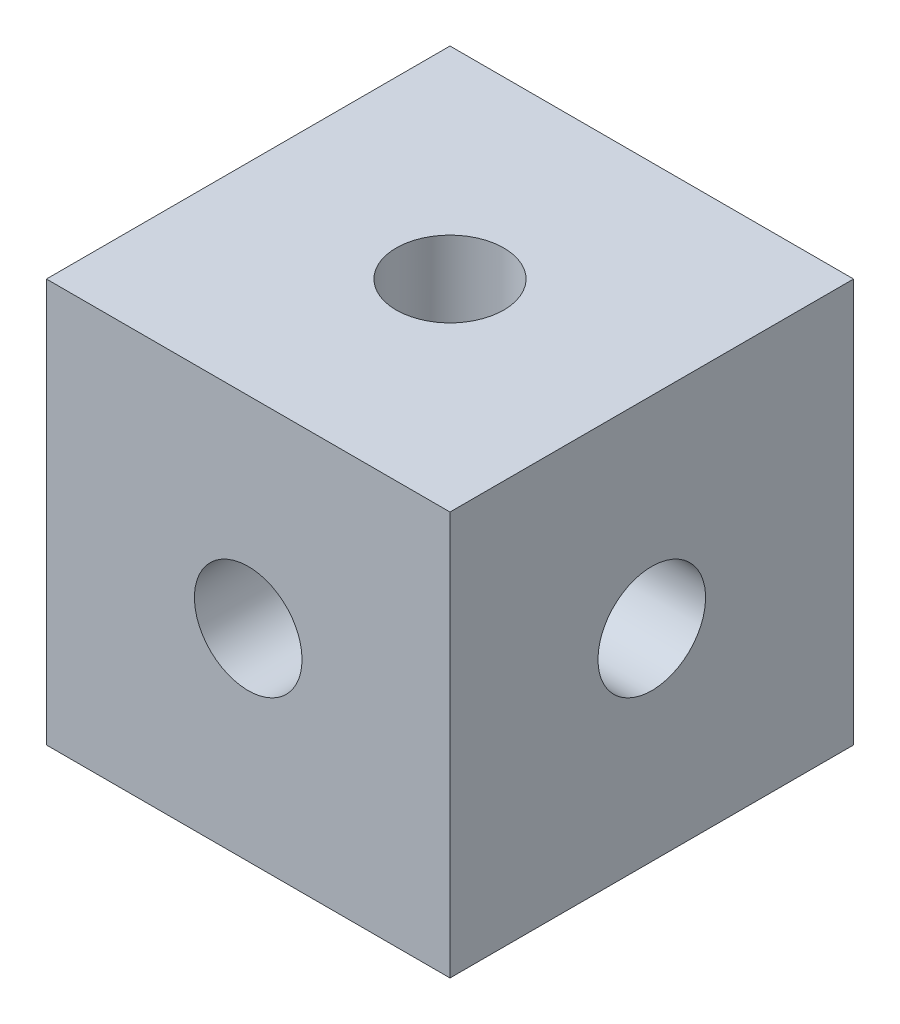
ISO-10303-21;
HEADER;
FILE_DESCRIPTION(('STEP AP214'),'2;1');
FILE_NAME('part.step','',(''),(''),'','','');
FILE_SCHEMA(('AUTOMOTIVE_DESIGN { 1 0 10303 214 1 1 1 1 }'));
ENDSEC;
DATA;
#1=APPLICATION_CONTEXT('core data for automotive mechanical design processes');
#2=APPLICATION_PROTOCOL_DEFINITION('international standard','automotive_design',2000,#1);
#3=PRODUCT_CONTEXT('',#1,'mechanical');
#4=PRODUCT('Part','Part','',(#3));
#5=PRODUCT_RELATED_PRODUCT_CATEGORY('part','',(#4));
#6=PRODUCT_DEFINITION_FORMATION('','',#4);
#7=PRODUCT_DEFINITION_CONTEXT('part definition',#1,'design');
#8=PRODUCT_DEFINITION('design','',#6,#7);
#9=PRODUCT_DEFINITION_SHAPE('','',#8);
#10=(LENGTH_UNIT() NAMED_UNIT(*) SI_UNIT(.MILLI.,.METRE.));
#11=(NAMED_UNIT(*) PLANE_ANGLE_UNIT() SI_UNIT($,.RADIAN.));
#12=(NAMED_UNIT(*) SI_UNIT($,.STERADIAN.) SOLID_ANGLE_UNIT());
#13=UNCERTAINTY_MEASURE_WITH_UNIT(LENGTH_MEASURE(1.E-05),#10,'distance_accuracy_value','');
#14=(GEOMETRIC_REPRESENTATION_CONTEXT(3) GLOBAL_UNCERTAINTY_ASSIGNED_CONTEXT((#13)) GLOBAL_UNIT_ASSIGNED_CONTEXT((#10,
#11,#12)) REPRESENTATION_CONTEXT('',''));
#15=CARTESIAN_POINT('',(0.,0.,0.));
#16=DIRECTION('',(0.,0.,1.));
#17=DIRECTION('',(1.,0.,0.));
#18=AXIS2_PLACEMENT_3D('',#15,#16,#17);
#19=CARTESIAN_POINT('',(0.,15.,0.));
#20=DIRECTION('',(0.,-1.,0.));
#21=DIRECTION('',(0.,0.,-1.));
#22=AXIS2_PLACEMENT_3D('',#19,#20,#21);
#23=CYLINDRICAL_SURFACE('',#22,2.);
#24=CARTESIAN_POINT('',(0.,7.5,0.));
#25=DIRECTION('',(-0.707106781186547,-0.707106781186547,0.));
#26=DIRECTION('',(0.707106781186547,-0.707106781186547,0.));
#27=AXIS2_PLACEMENT_3D('',#24,#25,#26);
#28=ELLIPSE('',#27,2.82842712474619,2.);
#29=CARTESIAN_POINT('',(-1.41421356237309,8.9142135623731,-1.41421356237309));
#30=VERTEX_POINT('',#29);
#31=CARTESIAN_POINT('',(-1.41421356237309,8.9142135623731,1.4142135623731));
#32=VERTEX_POINT('',#31);
#33=EDGE_CURVE('E68',#30,#32,#28,.F.);
#34=ORIENTED_EDGE('',*,*,#33,.F.);
#35=CARTESIAN_POINT('',(0.,7.5,0.));
#36=DIRECTION('',(0.,-0.707106781186547,-0.707106781186547));
#37=DIRECTION('',(0.,-0.707106781186547,0.707106781186547));
#38=AXIS2_PLACEMENT_3D('',#35,#36,#37);
#39=ELLIPSE('',#38,2.82842712474619,2.);
#40=CARTESIAN_POINT('',(1.4142135623731,8.9142135623731,-1.41421356237309));
#41=VERTEX_POINT('',#40);
#42=EDGE_CURVE('E131',#41,#30,#39,.F.);
#43=ORIENTED_EDGE('',*,*,#42,.F.);
#44=CARTESIAN_POINT('',(0.,7.5,0.));
#45=DIRECTION('',(0.707106781186547,-0.707106781186547,0.));
#46=DIRECTION('',(-0.707106781186547,-0.707106781186547,0.));
#47=AXIS2_PLACEMENT_3D('',#44,#45,#46);
#48=ELLIPSE('',#47,2.82842712474619,2.);
#49=CARTESIAN_POINT('',(1.4142135623731,8.9142135623731,1.4142135623731));
#50=VERTEX_POINT('',#49);
#51=EDGE_CURVE('E146',#50,#41,#48,.F.);
#52=ORIENTED_EDGE('',*,*,#51,.F.);
#53=CARTESIAN_POINT('',(0.,7.5,0.));
#54=DIRECTION('',(0.,-0.707106781186547,0.707106781186547));
#55=DIRECTION('',(0.,-0.707106781186547,-0.707106781186547));
#56=AXIS2_PLACEMENT_3D('',#53,#54,#55);
#57=ELLIPSE('',#56,2.82842712474619,2.);
#58=EDGE_CURVE('E116',#32,#50,#57,.F.);
#59=ORIENTED_EDGE('',*,*,#58,.F.);
#60=EDGE_LOOP('',(#34,#43,#52,#59));
#61=FACE_BOUND('',#60,.T.);
#62=CARTESIAN_POINT('',(0.,15.,0.));
#63=DIRECTION('',(0.,1.,0.));
#64=DIRECTION('',(0.,0.,1.));
#65=AXIS2_PLACEMENT_3D('',#62,#63,#64);
#66=CIRCLE('',#65,2.);
#67=CARTESIAN_POINT('',(0.,15.,2.));
#68=VERTEX_POINT('',#67);
#69=EDGE_CURVE('E167',#68,#68,#66,.T.);
#70=ORIENTED_EDGE('',*,*,#69,.T.);
#71=EDGE_LOOP('',(#70));
#72=FACE_BOUND('',#71,.T.);
#73=ADVANCED_FACE('F45',(#61,#72),#23,.F.);
#74=CARTESIAN_POINT('',(0.,15.,0.));
#75=DIRECTION('',(0.,1.,0.));
#76=DIRECTION('',(0.,0.,1.));
#77=AXIS2_PLACEMENT_3D('',#74,#75,#76);
#78=PLANE('',#77);
#79=DIRECTION('',(0.,0.,-1.));
#80=VECTOR('',#79,1.);
#81=CARTESIAN_POINT('',(7.5,15.,-7.5));
#82=LINE('',#81,#80);
#83=CARTESIAN_POINT('',(7.5,15.,7.5));
#84=VERTEX_POINT('',#83);
#85=CARTESIAN_POINT('',(7.5,15.,-7.5));
#86=VERTEX_POINT('',#85);
#87=EDGE_CURVE('E175',#84,#86,#82,.T.);
#88=ORIENTED_EDGE('',*,*,#87,.T.);
#89=DIRECTION('',(-1.,0.,0.));
#90=VECTOR('',#89,1.);
#91=CARTESIAN_POINT('',(-7.5,15.,-7.5));
#92=LINE('',#91,#90);
#93=CARTESIAN_POINT('',(-7.5,15.,-7.5));
#94=VERTEX_POINT('',#93);
#95=EDGE_CURVE('E179',#86,#94,#92,.T.);
#96=ORIENTED_EDGE('',*,*,#95,.T.);
#97=DIRECTION('',(0.,0.,1.));
#98=VECTOR('',#97,1.);
#99=CARTESIAN_POINT('',(-7.5,15.,-7.5));
#100=LINE('',#99,#98);
#101=CARTESIAN_POINT('',(-7.5,15.,7.5));
#102=VERTEX_POINT('',#101);
#103=EDGE_CURVE('E183',#94,#102,#100,.T.);
#104=ORIENTED_EDGE('',*,*,#103,.T.);
#105=DIRECTION('',(1.,0.,0.));
#106=VECTOR('',#105,1.);
#107=CARTESIAN_POINT('',(-7.5,15.,7.5));
#108=LINE('',#107,#106);
#109=EDGE_CURVE('E186',#102,#84,#108,.T.);
#110=ORIENTED_EDGE('',*,*,#109,.T.);
#111=EDGE_LOOP('',(#88,#96,#104,#110));
#112=FACE_BOUND('',#111,.T.);
#113=ORIENTED_EDGE('',*,*,#69,.F.);
#114=EDGE_LOOP('',(#113));
#115=FACE_BOUND('',#114,.T.);
#116=ADVANCED_FACE('F234',(#112,#115),#78,.T.);
#117=CARTESIAN_POINT('',(0.,0.,0.));
#118=DIRECTION('',(0.,1.,0.));
#119=DIRECTION('',(0.,0.,1.));
#120=AXIS2_PLACEMENT_3D('',#117,#118,#119);
#121=PLANE('',#120);
#122=DIRECTION('',(0.,0.,-1.));
#123=VECTOR('',#122,1.);
#124=CARTESIAN_POINT('',(7.5,0.,-7.5));
#125=LINE('',#124,#123);
#126=CARTESIAN_POINT('',(7.5,0.,7.5));
#127=VERTEX_POINT('',#126);
#128=CARTESIAN_POINT('',(7.5,0.,-7.5));
#129=VERTEX_POINT('',#128);
#130=EDGE_CURVE('E171',#127,#129,#125,.T.);
#131=ORIENTED_EDGE('',*,*,#130,.F.);
#132=DIRECTION('',(1.,0.,0.));
#133=VECTOR('',#132,1.);
#134=CARTESIAN_POINT('',(-7.5,0.,7.5));
#135=LINE('',#134,#133);
#136=CARTESIAN_POINT('',(-7.5,0.,7.5));
#137=VERTEX_POINT('',#136);
#138=EDGE_CURVE('E180',#137,#127,#135,.T.);
#139=ORIENTED_EDGE('',*,*,#138,.F.);
#140=DIRECTION('',(0.,0.,1.));
#141=VECTOR('',#140,1.);
#142=CARTESIAN_POINT('',(-7.5,0.,-7.5));
#143=LINE('',#142,#141);
#144=CARTESIAN_POINT('',(-7.5,0.,-7.5));
#145=VERTEX_POINT('',#144);
#146=EDGE_CURVE('E196',#145,#137,#143,.T.);
#147=ORIENTED_EDGE('',*,*,#146,.F.);
#148=DIRECTION('',(-1.,0.,0.));
#149=VECTOR('',#148,1.);
#150=CARTESIAN_POINT('',(-7.5,0.,-7.5));
#151=LINE('',#150,#149);
#152=EDGE_CURVE('E193',#129,#145,#151,.T.);
#153=ORIENTED_EDGE('',*,*,#152,.F.);
#154=EDGE_LOOP('',(#131,#139,#147,#153));
#155=FACE_BOUND('',#154,.T.);
#156=CARTESIAN_POINT('',(0.,0.,0.));
#157=DIRECTION('',(0.,1.,0.));
#158=DIRECTION('',(0.,0.,1.));
#159=AXIS2_PLACEMENT_3D('',#156,#157,#158);
#160=CIRCLE('',#159,2.);
#161=CARTESIAN_POINT('',(0.,0.,2.));
#162=VERTEX_POINT('',#161);
#163=EDGE_CURVE('E163',#162,#162,#160,.T.);
#164=ORIENTED_EDGE('',*,*,#163,.T.);
#165=EDGE_LOOP('',(#164));
#166=FACE_BOUND('',#165,.T.);
#167=ADVANCED_FACE('F223',(#155,#166),#121,.F.);
#168=CARTESIAN_POINT('',(7.5,15.,-7.5));
#169=DIRECTION('',(-1.,0.,0.));
#170=DIRECTION('',(0.,0.,1.));
#171=AXIS2_PLACEMENT_3D('',#168,#169,#170);
#172=PLANE('',#171);
#173=CARTESIAN_POINT('',(7.5,7.5,0.));
#174=DIRECTION('',(-1.,0.,0.));
#175=DIRECTION('',(0.,0.,1.));
#176=AXIS2_PLACEMENT_3D('',#173,#174,#175);
#177=CIRCLE('',#176,2.);
#178=CARTESIAN_POINT('',(7.5,7.5,2.));
#179=VERTEX_POINT('',#178);
#180=EDGE_CURVE('E126',#179,#179,#177,.T.);
#181=ORIENTED_EDGE('',*,*,#180,.T.);
#182=EDGE_LOOP('',(#181));
#183=FACE_BOUND('',#182,.T.);
#184=ORIENTED_EDGE('',*,*,#130,.T.);
#185=DIRECTION('',(0.,-1.,0.));
#186=VECTOR('',#185,1.);
#187=CARTESIAN_POINT('',(7.5,15.,-7.5));
#188=LINE('',#187,#186);
#189=EDGE_CURVE('E137',#86,#129,#188,.T.);
#190=ORIENTED_EDGE('',*,*,#189,.F.);
#191=ORIENTED_EDGE('',*,*,#87,.F.);
#192=DIRECTION('',(0.,-1.,0.));
#193=VECTOR('',#192,1.);
#194=CARTESIAN_POINT('',(7.5,15.,7.5));
#195=LINE('',#194,#193);
#196=EDGE_CURVE('E189',#84,#127,#195,.T.);
#197=ORIENTED_EDGE('',*,*,#196,.T.);
#198=EDGE_LOOP('',(#184,#190,#191,#197));
#199=FACE_BOUND('',#198,.T.);
#200=ADVANCED_FACE('F47',(#183,#199),#172,.F.);
#201=CARTESIAN_POINT('',(-7.5,15.,-7.5));
#202=DIRECTION('',(0.,0.,1.));
#203=DIRECTION('',(1.,0.,0.));
#204=AXIS2_PLACEMENT_3D('',#201,#202,#203);
#205=PLANE('',#204);
#206=CARTESIAN_POINT('',(0.,7.5,-7.5));
#207=DIRECTION('',(0.,0.,1.));
#208=DIRECTION('',(1.,0.,0.));
#209=AXIS2_PLACEMENT_3D('',#206,#207,#208);
#210=CIRCLE('',#209,2.);
#211=CARTESIAN_POINT('',(2.,7.5,-7.5));
#212=VERTEX_POINT('',#211);
#213=EDGE_CURVE('E159',#212,#212,#210,.T.);
#214=ORIENTED_EDGE('',*,*,#213,.T.);
#215=EDGE_LOOP('',(#214));
#216=FACE_BOUND('',#215,.T.);
#217=ORIENTED_EDGE('',*,*,#152,.T.);
#218=DIRECTION('',(0.,-1.,0.));
#219=VECTOR('',#218,1.);
#220=CARTESIAN_POINT('',(-7.5,15.,-7.5));
#221=LINE('',#220,#219);
#222=EDGE_CURVE('E208',#94,#145,#221,.T.);
#223=ORIENTED_EDGE('',*,*,#222,.F.);
#224=ORIENTED_EDGE('',*,*,#95,.F.);
#225=ORIENTED_EDGE('',*,*,#189,.T.);
#226=EDGE_LOOP('',(#217,#223,#224,#225));
#227=FACE_BOUND('',#226,.T.);
#228=ADVANCED_FACE('F215',(#216,#227),#205,.F.);
#229=CARTESIAN_POINT('',(-7.5,15.,-7.5));
#230=DIRECTION('',(1.,0.,0.));
#231=DIRECTION('',(0.,0.,-1.));
#232=AXIS2_PLACEMENT_3D('',#229,#230,#231);
#233=PLANE('',#232);
#234=CARTESIAN_POINT('',(-7.5,7.5,0.));
#235=DIRECTION('',(-1.,0.,0.));
#236=DIRECTION('',(0.,0.,1.));
#237=AXIS2_PLACEMENT_3D('',#234,#235,#236);
#238=CIRCLE('',#237,2.);
#239=CARTESIAN_POINT('',(-7.5,7.5,2.));
#240=VERTEX_POINT('',#239);
#241=EDGE_CURVE('E275',#240,#240,#238,.T.);
#242=ORIENTED_EDGE('',*,*,#241,.F.);
#243=EDGE_LOOP('',(#242));
#244=FACE_BOUND('',#243,.T.);
#245=ORIENTED_EDGE('',*,*,#146,.T.);
#246=DIRECTION('',(0.,-1.,0.));
#247=VECTOR('',#246,1.);
#248=CARTESIAN_POINT('',(-7.5,15.,7.5));
#249=LINE('',#248,#247);
#250=EDGE_CURVE('E204',#102,#137,#249,.T.);
#251=ORIENTED_EDGE('',*,*,#250,.F.);
#252=ORIENTED_EDGE('',*,*,#103,.F.);
#253=ORIENTED_EDGE('',*,*,#222,.T.);
#254=EDGE_LOOP('',(#245,#251,#252,#253));
#255=FACE_BOUND('',#254,.T.);
#256=ADVANCED_FACE('F228',(#244,#255),#233,.F.);
#257=CARTESIAN_POINT('',(-7.5,15.,7.5));
#258=DIRECTION('',(0.,0.,-1.));
#259=DIRECTION('',(-1.,0.,0.));
#260=AXIS2_PLACEMENT_3D('',#257,#258,#259);
#261=PLANE('',#260);
#262=CARTESIAN_POINT('',(0.,7.5,7.5));
#263=DIRECTION('',(0.,0.,1.));
#264=DIRECTION('',(1.,0.,0.));
#265=AXIS2_PLACEMENT_3D('',#262,#263,#264);
#266=CIRCLE('',#265,2.);
#267=CARTESIAN_POINT('',(2.,7.5,7.5));
#268=VERTEX_POINT('',#267);
#269=EDGE_CURVE('E153',#268,#268,#266,.T.);
#270=ORIENTED_EDGE('',*,*,#269,.F.);
#271=EDGE_LOOP('',(#270));
#272=FACE_BOUND('',#271,.T.);
#273=ORIENTED_EDGE('',*,*,#138,.T.);
#274=ORIENTED_EDGE('',*,*,#196,.F.);
#275=ORIENTED_EDGE('',*,*,#109,.F.);
#276=ORIENTED_EDGE('',*,*,#250,.T.);
#277=EDGE_LOOP('',(#273,#274,#275,#276));
#278=FACE_BOUND('',#277,.T.);
#279=ADVANCED_FACE('F232',(#272,#278),#261,.F.);
#280=CARTESIAN_POINT('',(0.,7.5,0.));
#281=DIRECTION('',(-0.707106781186547,-0.707106781186547,0.));
#282=DIRECTION('',(0.707106781186547,-0.707106781186547,0.));
#283=AXIS2_PLACEMENT_3D('',#280,#281,#282);
#284=ELLIPSE('',#283,2.82842712474619,2.);
#285=CARTESIAN_POINT('',(1.4142135623731,6.08578643762691,-1.41421356237309));
#286=VERTEX_POINT('',#285);
#287=CARTESIAN_POINT('',(1.4142135623731,6.08578643762691,1.4142135623731));
#288=VERTEX_POINT('',#287);
#289=EDGE_CURVE('E61',#286,#288,#284,.T.);
#290=ORIENTED_EDGE('',*,*,#289,.F.);
#291=CARTESIAN_POINT('',(0.,7.5,0.));
#292=DIRECTION('',(0.,-0.707106781186547,0.707106781186547));
#293=DIRECTION('',(0.,-0.707106781186547,-0.707106781186547));
#294=AXIS2_PLACEMENT_3D('',#291,#292,#293);
#295=ELLIPSE('',#294,2.82842712474619,2.);
#296=CARTESIAN_POINT('',(-1.41421356237309,6.08578643762691,-1.41421356237309));
#297=VERTEX_POINT('',#296);
#298=EDGE_CURVE('E124',#297,#286,#295,.T.);
#299=ORIENTED_EDGE('',*,*,#298,.F.);
#300=CARTESIAN_POINT('',(0.,7.5,0.));
#301=DIRECTION('',(0.707106781186547,-0.707106781186547,0.));
#302=DIRECTION('',(-0.707106781186547,-0.707106781186547,0.));
#303=AXIS2_PLACEMENT_3D('',#300,#301,#302);
#304=ELLIPSE('',#303,2.82842712474619,2.);
#305=CARTESIAN_POINT('',(-1.41421356237309,6.08578643762691,1.4142135623731));
#306=VERTEX_POINT('',#305);
#307=EDGE_CURVE('E109',#306,#297,#304,.T.);
#308=ORIENTED_EDGE('',*,*,#307,.F.);
#309=CARTESIAN_POINT('',(0.,7.5,0.));
#310=DIRECTION('',(0.,-0.707106781186547,-0.707106781186547));
#311=DIRECTION('',(0.,-0.707106781186547,0.707106781186547));
#312=AXIS2_PLACEMENT_3D('',#309,#310,#311);
#313=ELLIPSE('',#312,2.82842712474619,2.);
#314=EDGE_CURVE('E122',#288,#306,#313,.T.);
#315=ORIENTED_EDGE('',*,*,#314,.F.);
#316=EDGE_LOOP('',(#290,#299,#308,#315));
#317=FACE_BOUND('',#316,.T.);
#318=ORIENTED_EDGE('',*,*,#163,.F.);
#319=EDGE_LOOP('',(#318));
#320=FACE_BOUND('',#319,.T.);
#321=ADVANCED_FACE('F120',(#317,#320),#23,.F.);
#322=CARTESIAN_POINT('',(0.,7.5,-7.5));
#323=DIRECTION('',(0.,0.,1.));
#324=DIRECTION('',(1.,0.,0.));
#325=AXIS2_PLACEMENT_3D('',#322,#323,#324);
#326=CYLINDRICAL_SURFACE('',#325,2.);
#327=ORIENTED_EDGE('',*,*,#42,.T.);
#328=CARTESIAN_POINT('',(0.,7.5,0.));
#329=DIRECTION('',(-0.707106781186547,0.,0.707106781186548));
#330=DIRECTION('',(0.707106781186548,0.,0.707106781186547));
#331=AXIS2_PLACEMENT_3D('',#328,#329,#330);
#332=ELLIPSE('',#331,2.82842712474619,2.);
#333=EDGE_CURVE('E155',#30,#297,#332,.T.);
#334=ORIENTED_EDGE('',*,*,#333,.T.);
#335=ORIENTED_EDGE('',*,*,#298,.T.);
#336=CARTESIAN_POINT('',(0.,7.5,0.));
#337=DIRECTION('',(0.707106781186548,0.,0.707106781186547));
#338=DIRECTION('',(-0.707106781186547,0.,0.707106781186548));
#339=AXIS2_PLACEMENT_3D('',#336,#337,#338);
#340=ELLIPSE('',#339,2.82842712474619,2.);
#341=EDGE_CURVE('E149',#286,#41,#340,.T.);
#342=ORIENTED_EDGE('',*,*,#341,.T.);
#343=EDGE_LOOP('',(#327,#334,#335,#342));
#344=FACE_BOUND('',#343,.T.);
#345=ORIENTED_EDGE('',*,*,#213,.F.);
#346=EDGE_LOOP('',(#345));
#347=FACE_BOUND('',#346,.T.);
#348=ADVANCED_FACE('F247',(#344,#347),#326,.F.);
#349=ORIENTED_EDGE('',*,*,#58,.T.);
#350=CARTESIAN_POINT('',(0.,7.5,0.));
#351=DIRECTION('',(-0.707106781186547,0.,0.707106781186548));
#352=DIRECTION('',(0.707106781186548,0.,0.707106781186547));
#353=AXIS2_PLACEMENT_3D('',#350,#351,#352);
#354=ELLIPSE('',#353,2.82842712474619,2.);
#355=EDGE_CURVE('E11',#50,#288,#354,.F.);
#356=ORIENTED_EDGE('',*,*,#355,.T.);
#357=ORIENTED_EDGE('',*,*,#314,.T.);
#358=CARTESIAN_POINT('',(0.,7.5,0.));
#359=DIRECTION('',(0.707106781186548,0.,0.707106781186547));
#360=DIRECTION('',(-0.707106781186547,0.,0.707106781186548));
#361=AXIS2_PLACEMENT_3D('',#358,#359,#360);
#362=ELLIPSE('',#361,2.82842712474619,2.);
#363=EDGE_CURVE('E54',#306,#32,#362,.F.);
#364=ORIENTED_EDGE('',*,*,#363,.T.);
#365=EDGE_LOOP('',(#349,#356,#357,#364));
#366=FACE_BOUND('',#365,.T.);
#367=ORIENTED_EDGE('',*,*,#269,.T.);
#368=EDGE_LOOP('',(#367));
#369=FACE_BOUND('',#368,.T.);
#370=ADVANCED_FACE('F128',(#366,#369),#326,.F.);
#371=CARTESIAN_POINT('',(7.5,7.5,0.));
#372=DIRECTION('',(-1.,0.,0.));
#373=DIRECTION('',(0.,0.,1.));
#374=AXIS2_PLACEMENT_3D('',#371,#372,#373);
#375=CYLINDRICAL_SURFACE('',#374,2.);
#376=ORIENTED_EDGE('',*,*,#241,.T.);
#377=EDGE_LOOP('',(#376));
#378=FACE_BOUND('',#377,.T.);
#379=ORIENTED_EDGE('',*,*,#33,.T.);
#380=ORIENTED_EDGE('',*,*,#363,.F.);
#381=ORIENTED_EDGE('',*,*,#307,.T.);
#382=ORIENTED_EDGE('',*,*,#333,.F.);
#383=EDGE_LOOP('',(#379,#380,#381,#382));
#384=FACE_BOUND('',#383,.T.);
#385=ADVANCED_FACE('F108',(#378,#384),#375,.F.);
#386=ORIENTED_EDGE('',*,*,#180,.F.);
#387=EDGE_LOOP('',(#386));
#388=FACE_BOUND('',#387,.T.);
#389=ORIENTED_EDGE('',*,*,#289,.T.);
#390=ORIENTED_EDGE('',*,*,#355,.F.);
#391=ORIENTED_EDGE('',*,*,#51,.T.);
#392=ORIENTED_EDGE('',*,*,#341,.F.);
#393=EDGE_LOOP('',(#389,#390,#391,#392));
#394=FACE_BOUND('',#393,.T.);
#395=ADVANCED_FACE('F283',(#388,#394),#375,.F.);
#396=CLOSED_SHELL('',(#73,#116,#167,#200,#228,#256,#279,#321,#348,#370,#385,#395));
#397=MANIFOLD_SOLID_BREP('B2',#396);
#398=ADVANCED_BREP_SHAPE_REPRESENTATION('',(#18,#397),#14);
#399=SHAPE_DEFINITION_REPRESENTATION(#9,#398);
ENDSEC;
END-ISO-10303-21;
